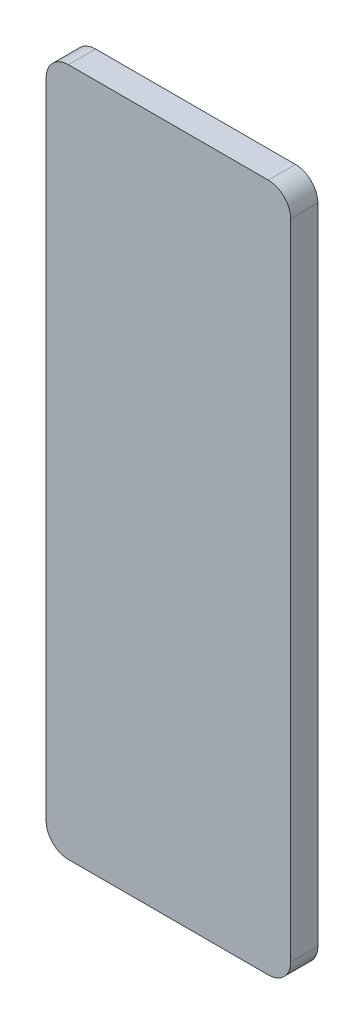
ISO-10303-21;
HEADER;
FILE_DESCRIPTION(('STEP AP214'),'2;1');
FILE_NAME('part.step','',(''),(''),'','','');
FILE_SCHEMA(('AUTOMOTIVE_DESIGN { 1 0 10303 214 1 1 1 1 }'));
ENDSEC;
DATA;
#1=APPLICATION_CONTEXT('core data for automotive mechanical design processes');
#2=APPLICATION_PROTOCOL_DEFINITION('international standard','automotive_design',2000,#1);
#3=PRODUCT_CONTEXT('',#1,'mechanical');
#4=PRODUCT('Part','Part','',(#3));
#5=PRODUCT_RELATED_PRODUCT_CATEGORY('part','',(#4));
#6=PRODUCT_DEFINITION_FORMATION('','',#4);
#7=PRODUCT_DEFINITION_CONTEXT('part definition',#1,'design');
#8=PRODUCT_DEFINITION('design','',#6,#7);
#9=PRODUCT_DEFINITION_SHAPE('','',#8);
#10=(LENGTH_UNIT() NAMED_UNIT(*) SI_UNIT(.MILLI.,.METRE.));
#11=(NAMED_UNIT(*) PLANE_ANGLE_UNIT() SI_UNIT($,.RADIAN.));
#12=(NAMED_UNIT(*) SI_UNIT($,.STERADIAN.) SOLID_ANGLE_UNIT());
#13=UNCERTAINTY_MEASURE_WITH_UNIT(LENGTH_MEASURE(1.E-05),#10,'distance_accuracy_value','');
#14=(GEOMETRIC_REPRESENTATION_CONTEXT(3) GLOBAL_UNCERTAINTY_ASSIGNED_CONTEXT((#13)) GLOBAL_UNIT_ASSIGNED_CONTEXT((#10,
#11,#12)) REPRESENTATION_CONTEXT('',''));
#15=CARTESIAN_POINT('',(0.,0.,0.));
#16=DIRECTION('',(0.,0.,1.));
#17=DIRECTION('',(1.,0.,0.));
#18=AXIS2_PLACEMENT_3D('',#15,#16,#17);
#19=CARTESIAN_POINT('',(0.675,1.9,0.15));
#20=DIRECTION('',(-1.,0.,0.));
#21=DIRECTION('',(0.,-1.,0.));
#22=AXIS2_PLACEMENT_3D('',#19,#20,#21);
#23=PLANE('',#22);
#24=DIRECTION('',(0.,1.,0.));
#25=VECTOR('',#24,1.);
#26=CARTESIAN_POINT('',(0.675,1.9,0.15));
#27=LINE('',#26,#25);
#28=CARTESIAN_POINT('',(0.675,-1.77666666666667,0.15));
#29=VERTEX_POINT('',#28);
#30=CARTESIAN_POINT('',(0.675,1.77666666666667,0.15));
#31=VERTEX_POINT('',#30);
#32=EDGE_CURVE('E132',#29,#31,#27,.T.);
#33=ORIENTED_EDGE('',*,*,#32,.F.);
#34=DIRECTION('',(0.,0.,-1.));
#35=VECTOR('',#34,1.);
#36=CARTESIAN_POINT('',(0.675,-1.77666666666667,0.15));
#37=LINE('',#36,#35);
#38=CARTESIAN_POINT('',(0.675,-1.77666666666667,0.));
#39=VERTEX_POINT('',#38);
#40=EDGE_CURVE('E116',#29,#39,#37,.T.);
#41=ORIENTED_EDGE('',*,*,#40,.T.);
#42=DIRECTION('',(0.,1.,0.));
#43=VECTOR('',#42,1.);
#44=CARTESIAN_POINT('',(0.675,1.9,0.));
#45=LINE('',#44,#43);
#46=CARTESIAN_POINT('',(0.675,1.77666666666667,0.));
#47=VERTEX_POINT('',#46);
#48=EDGE_CURVE('E129',#39,#47,#45,.T.);
#49=ORIENTED_EDGE('',*,*,#48,.T.);
#50=DIRECTION('',(0.,0.,-1.));
#51=VECTOR('',#50,1.);
#52=CARTESIAN_POINT('',(0.675,1.77666666666667,0.15));
#53=LINE('',#52,#51);
#54=EDGE_CURVE('E135',#47,#31,#53,.F.);
#55=ORIENTED_EDGE('',*,*,#54,.T.);
#56=EDGE_LOOP('',(#33,#41,#49,#55));
#57=FACE_BOUND('',#56,.T.);
#58=ADVANCED_FACE('F45',(#57),#23,.F.);
#59=CARTESIAN_POINT('',(-0.675,1.9,0.15));
#60=DIRECTION('',(0.,-1.,0.));
#61=DIRECTION('',(0.,0.,-1.));
#62=AXIS2_PLACEMENT_3D('',#59,#60,#61);
#63=PLANE('',#62);
#64=DIRECTION('',(-1.,0.,0.));
#65=VECTOR('',#64,1.);
#66=CARTESIAN_POINT('',(-0.675,1.9,0.));
#67=LINE('',#66,#65);
#68=CARTESIAN_POINT('',(0.551666666666666,1.9,0.));
#69=VERTEX_POINT('',#68);
#70=CARTESIAN_POINT('',(-0.551666666666667,1.9,0.));
#71=VERTEX_POINT('',#70);
#72=EDGE_CURVE('E140',#69,#71,#67,.T.);
#73=ORIENTED_EDGE('',*,*,#72,.T.);
#74=DIRECTION('',(0.,0.,-1.));
#75=VECTOR('',#74,1.);
#76=CARTESIAN_POINT('',(-0.551666666666667,1.9,0.15));
#77=LINE('',#76,#75);
#78=CARTESIAN_POINT('',(-0.551666666666667,1.9,0.15));
#79=VERTEX_POINT('',#78);
#80=EDGE_CURVE('E11',#71,#79,#77,.F.);
#81=ORIENTED_EDGE('',*,*,#80,.T.);
#82=DIRECTION('',(-1.,0.,0.));
#83=VECTOR('',#82,1.);
#84=CARTESIAN_POINT('',(-0.675,1.9,0.15));
#85=LINE('',#84,#83);
#86=CARTESIAN_POINT('',(0.551666666666666,1.9,0.15));
#87=VERTEX_POINT('',#86);
#88=EDGE_CURVE('E193',#87,#79,#85,.T.);
#89=ORIENTED_EDGE('',*,*,#88,.F.);
#90=DIRECTION('',(0.,0.,-1.));
#91=VECTOR('',#90,1.);
#92=CARTESIAN_POINT('',(0.551666666666666,1.9,0.15));
#93=LINE('',#92,#91);
#94=EDGE_CURVE('E54',#87,#69,#93,.T.);
#95=ORIENTED_EDGE('',*,*,#94,.T.);
#96=EDGE_LOOP('',(#73,#81,#89,#95));
#97=FACE_BOUND('',#96,.T.);
#98=ADVANCED_FACE('F191',(#97),#63,.F.);
#99=CARTESIAN_POINT('',(-0.675,1.9,0.15));
#100=DIRECTION('',(1.,0.,0.));
#101=DIRECTION('',(0.,1.,0.));
#102=AXIS2_PLACEMENT_3D('',#99,#100,#101);
#103=PLANE('',#102);
#104=DIRECTION('',(0.,-1.,0.));
#105=VECTOR('',#104,1.);
#106=CARTESIAN_POINT('',(-0.675,1.9,0.));
#107=LINE('',#106,#105);
#108=CARTESIAN_POINT('',(-0.675,1.77666666666667,0.));
#109=VERTEX_POINT('',#108);
#110=CARTESIAN_POINT('',(-0.675,-1.77666666666667,0.));
#111=VERTEX_POINT('',#110);
#112=EDGE_CURVE('E145',#109,#111,#107,.T.);
#113=ORIENTED_EDGE('',*,*,#112,.T.);
#114=DIRECTION('',(0.,0.,-1.));
#115=VECTOR('',#114,1.);
#116=CARTESIAN_POINT('',(-0.675,-1.77666666666667,0.15));
#117=LINE('',#116,#115);
#118=CARTESIAN_POINT('',(-0.675,-1.77666666666667,0.15));
#119=VERTEX_POINT('',#118);
#120=EDGE_CURVE('E61',#111,#119,#117,.F.);
#121=ORIENTED_EDGE('',*,*,#120,.T.);
#122=DIRECTION('',(0.,-1.,0.));
#123=VECTOR('',#122,1.);
#124=CARTESIAN_POINT('',(-0.675,1.9,0.15));
#125=LINE('',#124,#123);
#126=CARTESIAN_POINT('',(-0.675,1.77666666666667,0.15));
#127=VERTEX_POINT('',#126);
#128=EDGE_CURVE('E201',#127,#119,#125,.T.);
#129=ORIENTED_EDGE('',*,*,#128,.F.);
#130=DIRECTION('',(0.,0.,-1.));
#131=VECTOR('',#130,1.);
#132=CARTESIAN_POINT('',(-0.675,1.77666666666667,0.15));
#133=LINE('',#132,#131);
#134=EDGE_CURVE('E181',#127,#109,#133,.T.);
#135=ORIENTED_EDGE('',*,*,#134,.T.);
#136=EDGE_LOOP('',(#113,#121,#129,#135));
#137=FACE_BOUND('',#136,.T.);
#138=ADVANCED_FACE('F200',(#137),#103,.F.);
#139=CARTESIAN_POINT('',(-0.675,-1.9,0.15));
#140=DIRECTION('',(0.,1.,0.));
#141=DIRECTION('',(0.,0.,1.));
#142=AXIS2_PLACEMENT_3D('',#139,#140,#141);
#143=PLANE('',#142);
#144=DIRECTION('',(1.,0.,0.));
#145=VECTOR('',#144,1.);
#146=CARTESIAN_POINT('',(-0.675,-1.9,0.));
#147=LINE('',#146,#145);
#148=CARTESIAN_POINT('',(-0.551666666666667,-1.9,0.));
#149=VERTEX_POINT('',#148);
#150=CARTESIAN_POINT('',(0.551666666666666,-1.9,0.));
#151=VERTEX_POINT('',#150);
#152=EDGE_CURVE('E153',#149,#151,#147,.T.);
#153=ORIENTED_EDGE('',*,*,#152,.T.);
#154=DIRECTION('',(0.,0.,-1.));
#155=VECTOR('',#154,1.);
#156=CARTESIAN_POINT('',(0.551666666666667,-1.9,0.15));
#157=LINE('',#156,#155);
#158=CARTESIAN_POINT('',(0.551666666666666,-1.9,0.15));
#159=VERTEX_POINT('',#158);
#160=EDGE_CURVE('E117',#151,#159,#157,.F.);
#161=ORIENTED_EDGE('',*,*,#160,.T.);
#162=DIRECTION('',(1.,0.,0.));
#163=VECTOR('',#162,1.);
#164=CARTESIAN_POINT('',(-0.675,-1.9,0.15));
#165=LINE('',#164,#163);
#166=CARTESIAN_POINT('',(-0.551666666666667,-1.9,0.15));
#167=VERTEX_POINT('',#166);
#168=EDGE_CURVE('E148',#167,#159,#165,.T.);
#169=ORIENTED_EDGE('',*,*,#168,.F.);
#170=DIRECTION('',(0.,0.,-1.));
#171=VECTOR('',#170,1.);
#172=CARTESIAN_POINT('',(-0.551666666666667,-1.9,0.15));
#173=LINE('',#172,#171);
#174=EDGE_CURVE('E123',#167,#149,#173,.T.);
#175=ORIENTED_EDGE('',*,*,#174,.T.);
#176=EDGE_LOOP('',(#153,#161,#169,#175));
#177=FACE_BOUND('',#176,.T.);
#178=ADVANCED_FACE('F229',(#177),#143,.F.);
#179=CARTESIAN_POINT('',(0.,0.,0.15));
#180=DIRECTION('',(0.,0.,1.));
#181=DIRECTION('',(1.,0.,0.));
#182=AXIS2_PLACEMENT_3D('',#179,#180,#181);
#183=PLANE('',#182);
#184=ORIENTED_EDGE('',*,*,#168,.T.);
#185=CARTESIAN_POINT('',(0.551666666666667,-1.77666666666667,0.15));
#186=DIRECTION('',(0.,0.,1.));
#187=DIRECTION('',(1.,0.,0.));
#188=AXIS2_PLACEMENT_3D('',#185,#186,#187);
#189=CIRCLE('',#188,0.123333333333333);
#190=EDGE_CURVE('E178',#159,#29,#189,.T.);
#191=ORIENTED_EDGE('',*,*,#190,.T.);
#192=ORIENTED_EDGE('',*,*,#32,.T.);
#193=CARTESIAN_POINT('',(0.551666666666666,1.77666666666667,0.15));
#194=DIRECTION('',(0.,0.,1.));
#195=DIRECTION('',(1.,0.,0.));
#196=AXIS2_PLACEMENT_3D('',#193,#194,#195);
#197=CIRCLE('',#196,0.123333333333333);
#198=EDGE_CURVE('E170',#31,#87,#197,.T.);
#199=ORIENTED_EDGE('',*,*,#198,.T.);
#200=ORIENTED_EDGE('',*,*,#88,.T.);
#201=CARTESIAN_POINT('',(-0.551666666666667,1.77666666666667,0.15));
#202=DIRECTION('',(0.,0.,1.));
#203=DIRECTION('',(1.,0.,0.));
#204=AXIS2_PLACEMENT_3D('',#201,#202,#203);
#205=CIRCLE('',#204,0.123333333333333);
#206=EDGE_CURVE('E68',#79,#127,#205,.T.);
#207=ORIENTED_EDGE('',*,*,#206,.T.);
#208=ORIENTED_EDGE('',*,*,#128,.T.);
#209=CARTESIAN_POINT('',(-0.551666666666667,-1.77666666666667,0.15));
#210=DIRECTION('',(0.,0.,1.));
#211=DIRECTION('',(1.,0.,0.));
#212=AXIS2_PLACEMENT_3D('',#209,#210,#211);
#213=CIRCLE('',#212,0.123333333333333);
#214=EDGE_CURVE('E175',#119,#167,#213,.T.);
#215=ORIENTED_EDGE('',*,*,#214,.T.);
#216=EDGE_LOOP('',(#184,#191,#192,#199,#200,#207,#208,#215));
#217=FACE_BOUND('',#216,.T.);
#218=ADVANCED_FACE('F209',(#217),#183,.T.);
#219=CARTESIAN_POINT('',(0.,0.,0.));
#220=DIRECTION('',(0.,0.,1.));
#221=DIRECTION('',(1.,0.,0.));
#222=AXIS2_PLACEMENT_3D('',#219,#220,#221);
#223=PLANE('',#222);
#224=ORIENTED_EDGE('',*,*,#48,.F.);
#225=CARTESIAN_POINT('',(0.551666666666667,-1.77666666666667,0.));
#226=DIRECTION('',(0.,0.,1.));
#227=DIRECTION('',(1.,0.,0.));
#228=AXIS2_PLACEMENT_3D('',#225,#226,#227);
#229=CIRCLE('',#228,0.123333333333333);
#230=EDGE_CURVE('E112',#39,#151,#229,.F.);
#231=ORIENTED_EDGE('',*,*,#230,.T.);
#232=ORIENTED_EDGE('',*,*,#152,.F.);
#233=CARTESIAN_POINT('',(-0.551666666666667,-1.77666666666667,0.));
#234=DIRECTION('',(0.,0.,1.));
#235=DIRECTION('',(1.,0.,0.));
#236=AXIS2_PLACEMENT_3D('',#233,#234,#235);
#237=CIRCLE('',#236,0.123333333333333);
#238=EDGE_CURVE('E124',#149,#111,#237,.F.);
#239=ORIENTED_EDGE('',*,*,#238,.T.);
#240=ORIENTED_EDGE('',*,*,#112,.F.);
#241=CARTESIAN_POINT('',(-0.551666666666667,1.77666666666667,0.));
#242=DIRECTION('',(0.,0.,1.));
#243=DIRECTION('',(1.,0.,0.));
#244=AXIS2_PLACEMENT_3D('',#241,#242,#243);
#245=CIRCLE('',#244,0.123333333333333);
#246=EDGE_CURVE('E160',#109,#71,#245,.F.);
#247=ORIENTED_EDGE('',*,*,#246,.T.);
#248=ORIENTED_EDGE('',*,*,#72,.F.);
#249=CARTESIAN_POINT('',(0.551666666666666,1.77666666666667,0.));
#250=DIRECTION('',(0.,0.,1.));
#251=DIRECTION('',(1.,0.,0.));
#252=AXIS2_PLACEMENT_3D('',#249,#250,#251);
#253=CIRCLE('',#252,0.123333333333333);
#254=EDGE_CURVE('E134',#69,#47,#253,.F.);
#255=ORIENTED_EDGE('',*,*,#254,.T.);
#256=EDGE_LOOP('',(#224,#231,#232,#239,#240,#247,#248,#255));
#257=FACE_BOUND('',#256,.T.);
#258=ADVANCED_FACE('F137',(#257),#223,.F.);
#259=CARTESIAN_POINT('',(0.551666666666667,-1.77666666666667,0.15));
#260=DIRECTION('',(0.,0.,-1.));
#261=DIRECTION('',(-1.,0.,0.));
#262=AXIS2_PLACEMENT_3D('',#259,#260,#261);
#263=CYLINDRICAL_SURFACE('',#262,0.123333333333333);
#264=ORIENTED_EDGE('',*,*,#190,.F.);
#265=ORIENTED_EDGE('',*,*,#160,.F.);
#266=ORIENTED_EDGE('',*,*,#230,.F.);
#267=ORIENTED_EDGE('',*,*,#40,.F.);
#268=EDGE_LOOP('',(#264,#265,#266,#267));
#269=FACE_BOUND('',#268,.T.);
#270=ADVANCED_FACE('F115',(#269),#263,.T.);
#271=CARTESIAN_POINT('',(-0.551666666666667,-1.77666666666667,0.15));
#272=DIRECTION('',(0.,0.,-1.));
#273=DIRECTION('',(-1.,0.,0.));
#274=AXIS2_PLACEMENT_3D('',#271,#272,#273);
#275=CYLINDRICAL_SURFACE('',#274,0.123333333333333);
#276=ORIENTED_EDGE('',*,*,#214,.F.);
#277=ORIENTED_EDGE('',*,*,#120,.F.);
#278=ORIENTED_EDGE('',*,*,#238,.F.);
#279=ORIENTED_EDGE('',*,*,#174,.F.);
#280=EDGE_LOOP('',(#276,#277,#278,#279));
#281=FACE_BOUND('',#280,.T.);
#282=ADVANCED_FACE('F213',(#281),#275,.T.);
#283=CARTESIAN_POINT('',(-0.551666666666667,1.77666666666667,0.15));
#284=DIRECTION('',(0.,0.,-1.));
#285=DIRECTION('',(-1.,0.,0.));
#286=AXIS2_PLACEMENT_3D('',#283,#284,#285);
#287=CYLINDRICAL_SURFACE('',#286,0.123333333333333);
#288=ORIENTED_EDGE('',*,*,#206,.F.);
#289=ORIENTED_EDGE('',*,*,#80,.F.);
#290=ORIENTED_EDGE('',*,*,#246,.F.);
#291=ORIENTED_EDGE('',*,*,#134,.F.);
#292=EDGE_LOOP('',(#288,#289,#290,#291));
#293=FACE_BOUND('',#292,.T.);
#294=ADVANCED_FACE('F199',(#293),#287,.T.);
#295=CARTESIAN_POINT('',(0.551666666666666,1.77666666666667,0.15));
#296=DIRECTION('',(0.,0.,-1.));
#297=DIRECTION('',(-1.,0.,0.));
#298=AXIS2_PLACEMENT_3D('',#295,#296,#297);
#299=CYLINDRICAL_SURFACE('',#298,0.123333333333333);
#300=ORIENTED_EDGE('',*,*,#198,.F.);
#301=ORIENTED_EDGE('',*,*,#54,.F.);
#302=ORIENTED_EDGE('',*,*,#254,.F.);
#303=ORIENTED_EDGE('',*,*,#94,.F.);
#304=EDGE_LOOP('',(#300,#301,#302,#303));
#305=FACE_BOUND('',#304,.T.);
#306=ADVANCED_FACE('F47',(#305),#299,.T.);
#307=CLOSED_SHELL('',(#58,#98,#138,#178,#218,#258,#270,#282,#294,#306));
#308=MANIFOLD_SOLID_BREP('B2',#307);
#309=ADVANCED_BREP_SHAPE_REPRESENTATION('',(#18,#308),#14);
#310=SHAPE_DEFINITION_REPRESENTATION(#9,#309);
ENDSEC;
END-ISO-10303-21;
